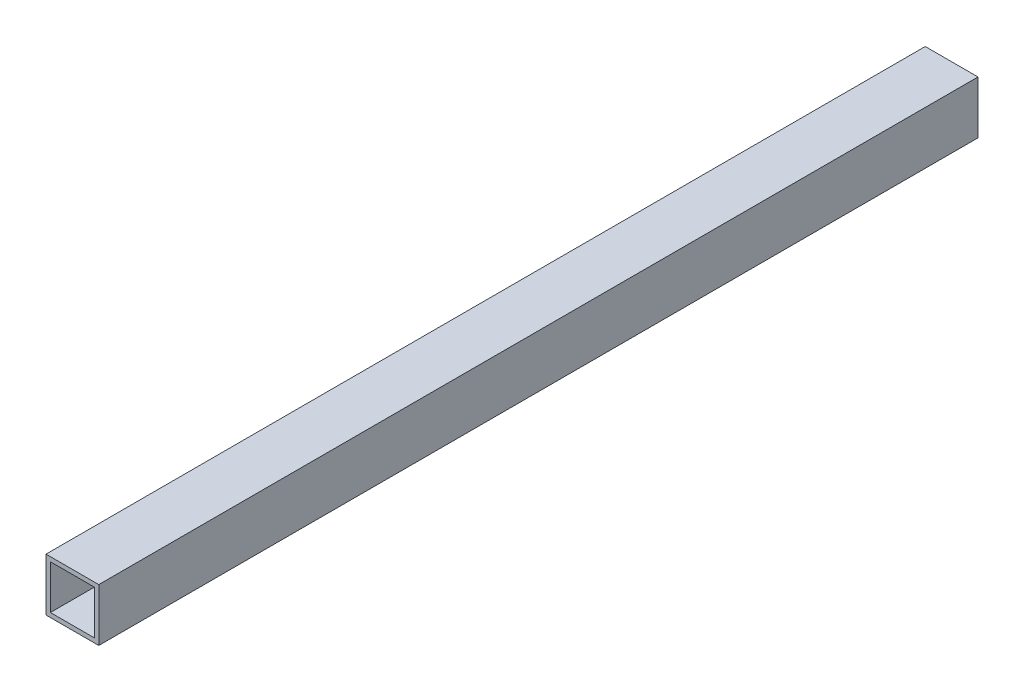
ISO-10303-21;
HEADER;
FILE_DESCRIPTION(('STEP AP214'),'2;1');
FILE_NAME('part.step','',(''),(''),'','','');
FILE_SCHEMA(('AUTOMOTIVE_DESIGN { 1 0 10303 214 1 1 1 1 }'));
ENDSEC;
DATA;
#1=APPLICATION_CONTEXT('core data for automotive mechanical design processes');
#2=APPLICATION_PROTOCOL_DEFINITION('international standard','automotive_design',2000,#1);
#3=PRODUCT_CONTEXT('',#1,'mechanical');
#4=PRODUCT('Part','Part','',(#3));
#5=PRODUCT_RELATED_PRODUCT_CATEGORY('part','',(#4));
#6=PRODUCT_DEFINITION_FORMATION('','',#4);
#7=PRODUCT_DEFINITION_CONTEXT('part definition',#1,'design');
#8=PRODUCT_DEFINITION('design','',#6,#7);
#9=PRODUCT_DEFINITION_SHAPE('','',#8);
#10=(LENGTH_UNIT() NAMED_UNIT(*) SI_UNIT(.MILLI.,.METRE.));
#11=(NAMED_UNIT(*) PLANE_ANGLE_UNIT() SI_UNIT($,.RADIAN.));
#12=(NAMED_UNIT(*) SI_UNIT($,.STERADIAN.) SOLID_ANGLE_UNIT());
#13=UNCERTAINTY_MEASURE_WITH_UNIT(LENGTH_MEASURE(1.E-05),#10,'distance_accuracy_value','');
#14=(GEOMETRIC_REPRESENTATION_CONTEXT(3) GLOBAL_UNCERTAINTY_ASSIGNED_CONTEXT((#13)) GLOBAL_UNIT_ASSIGNED_CONTEXT((#10,
#11,#12)) REPRESENTATION_CONTEXT('',''));
#15=CARTESIAN_POINT('',(0.,0.,0.));
#16=DIRECTION('',(0.,0.,1.));
#17=DIRECTION('',(1.,0.,0.));
#18=AXIS2_PLACEMENT_3D('',#15,#16,#17);
#19=CARTESIAN_POINT('',(0.,0.,250.));
#20=DIRECTION('',(0.,0.,1.));
#21=DIRECTION('',(1.,0.,0.));
#22=AXIS2_PLACEMENT_3D('',#19,#20,#21);
#23=PLANE('',#22);
#24=DIRECTION('',(1.,0.,0.));
#25=VECTOR('',#24,1.);
#26=CARTESIAN_POINT('',(-12.5,12.5,250.));
#27=LINE('',#26,#25);
#28=CARTESIAN_POINT('',(-12.5,12.5,250.));
#29=VERTEX_POINT('',#28);
#30=CARTESIAN_POINT('',(12.5,12.5,250.));
#31=VERTEX_POINT('',#30);
#32=EDGE_CURVE('E135',#29,#31,#27,.T.);
#33=ORIENTED_EDGE('',*,*,#32,.T.);
#34=DIRECTION('',(0.,-1.,0.));
#35=VECTOR('',#34,1.);
#36=CARTESIAN_POINT('',(12.5,12.5,250.));
#37=LINE('',#36,#35);
#38=CARTESIAN_POINT('',(12.5,-12.5,250.));
#39=VERTEX_POINT('',#38);
#40=EDGE_CURVE('E136',#31,#39,#37,.T.);
#41=ORIENTED_EDGE('',*,*,#40,.T.);
#42=DIRECTION('',(-1.,0.,0.));
#43=VECTOR('',#42,1.);
#44=CARTESIAN_POINT('',(12.5,-12.5,250.));
#45=LINE('',#44,#43);
#46=CARTESIAN_POINT('',(-12.5,-12.5,250.));
#47=VERTEX_POINT('',#46);
#48=EDGE_CURVE('E103',#39,#47,#45,.T.);
#49=ORIENTED_EDGE('',*,*,#48,.T.);
#50=DIRECTION('',(0.,1.,0.));
#51=VECTOR('',#50,1.);
#52=CARTESIAN_POINT('',(-12.5,-12.5,250.));
#53=LINE('',#52,#51);
#54=EDGE_CURVE('E102',#47,#29,#53,.T.);
#55=ORIENTED_EDGE('',*,*,#54,.T.);
#56=EDGE_LOOP('',(#33,#41,#49,#55));
#57=FACE_BOUND('',#56,.T.);
#58=DIRECTION('',(0.,-1.,0.));
#59=VECTOR('',#58,1.);
#60=CARTESIAN_POINT('',(-15.,15.,250.));
#61=LINE('',#60,#59);
#62=CARTESIAN_POINT('',(-15.,15.,250.));
#63=VERTEX_POINT('',#62);
#64=CARTESIAN_POINT('',(-15.,-15.,250.));
#65=VERTEX_POINT('',#64);
#66=EDGE_CURVE('E11',#63,#65,#61,.T.);
#67=ORIENTED_EDGE('',*,*,#66,.T.);
#68=DIRECTION('',(1.,0.,0.));
#69=VECTOR('',#68,1.);
#70=CARTESIAN_POINT('',(-15.,-15.,250.));
#71=LINE('',#70,#69);
#72=CARTESIAN_POINT('',(15.,-15.,250.));
#73=VERTEX_POINT('',#72);
#74=EDGE_CURVE('E155',#65,#73,#71,.T.);
#75=ORIENTED_EDGE('',*,*,#74,.T.);
#76=DIRECTION('',(0.,1.,0.));
#77=VECTOR('',#76,1.);
#78=CARTESIAN_POINT('',(15.,-15.,250.));
#79=LINE('',#78,#77);
#80=CARTESIAN_POINT('',(15.,15.,250.));
#81=VERTEX_POINT('',#80);
#82=EDGE_CURVE('E143',#73,#81,#79,.T.);
#83=ORIENTED_EDGE('',*,*,#82,.T.);
#84=DIRECTION('',(-1.,0.,0.));
#85=VECTOR('',#84,1.);
#86=CARTESIAN_POINT('',(15.,15.,250.));
#87=LINE('',#86,#85);
#88=EDGE_CURVE('E150',#81,#63,#87,.T.);
#89=ORIENTED_EDGE('',*,*,#88,.T.);
#90=EDGE_LOOP('',(#67,#75,#83,#89));
#91=FACE_BOUND('',#90,.T.);
#92=ADVANCED_FACE('F16',(#57,#91),#23,.T.);
#93=CARTESIAN_POINT('',(-15.,15.,0.));
#94=DIRECTION('',(-1.,0.,0.));
#95=DIRECTION('',(0.,-1.,0.));
#96=AXIS2_PLACEMENT_3D('',#93,#94,#95);
#97=PLANE('',#96);
#98=DIRECTION('',(0.,0.,1.));
#99=VECTOR('',#98,1.);
#100=CARTESIAN_POINT('',(-15.,-15.,0.));
#101=LINE('',#100,#99);
#102=CARTESIAN_POINT('',(-15.,-15.,-250.));
#103=VERTEX_POINT('',#102);
#104=EDGE_CURVE('E27',#103,#65,#101,.T.);
#105=ORIENTED_EDGE('',*,*,#104,.T.);
#106=ORIENTED_EDGE('',*,*,#66,.F.);
#107=DIRECTION('',(0.,0.,-1.));
#108=VECTOR('',#107,1.);
#109=CARTESIAN_POINT('',(-15.,15.,0.));
#110=LINE('',#109,#108);
#111=CARTESIAN_POINT('',(-15.,15.,-250.));
#112=VERTEX_POINT('',#111);
#113=EDGE_CURVE('E148',#63,#112,#110,.T.);
#114=ORIENTED_EDGE('',*,*,#113,.T.);
#115=DIRECTION('',(0.,1.,0.));
#116=VECTOR('',#115,1.);
#117=CARTESIAN_POINT('',(-15.,15.,-250.));
#118=LINE('',#117,#116);
#119=EDGE_CURVE('E130',#103,#112,#118,.T.);
#120=ORIENTED_EDGE('',*,*,#119,.F.);
#121=EDGE_LOOP('',(#105,#106,#114,#120));
#122=FACE_BOUND('',#121,.T.);
#123=ADVANCED_FACE('F174',(#122),#97,.T.);
#124=CARTESIAN_POINT('',(-15.,-15.,0.));
#125=DIRECTION('',(0.,-1.,0.));
#126=DIRECTION('',(1.,0.,0.));
#127=AXIS2_PLACEMENT_3D('',#124,#125,#126);
#128=PLANE('',#127);
#129=DIRECTION('',(0.,0.,1.));
#130=VECTOR('',#129,1.);
#131=CARTESIAN_POINT('',(15.,-15.,0.));
#132=LINE('',#131,#130);
#133=CARTESIAN_POINT('',(15.,-15.,-250.));
#134=VERTEX_POINT('',#133);
#135=EDGE_CURVE('E72',#134,#73,#132,.T.);
#136=ORIENTED_EDGE('',*,*,#135,.T.);
#137=ORIENTED_EDGE('',*,*,#74,.F.);
#138=ORIENTED_EDGE('',*,*,#104,.F.);
#139=DIRECTION('',(-1.,0.,0.));
#140=VECTOR('',#139,1.);
#141=CARTESIAN_POINT('',(-15.,-15.,-250.));
#142=LINE('',#141,#140);
#143=EDGE_CURVE('E122',#134,#103,#142,.T.);
#144=ORIENTED_EDGE('',*,*,#143,.F.);
#145=EDGE_LOOP('',(#136,#137,#138,#144));
#146=FACE_BOUND('',#145,.T.);
#147=ADVANCED_FACE('F177',(#146),#128,.T.);
#148=CARTESIAN_POINT('',(15.,-15.,0.));
#149=DIRECTION('',(1.,0.,0.));
#150=DIRECTION('',(0.,1.,0.));
#151=AXIS2_PLACEMENT_3D('',#148,#149,#150);
#152=PLANE('',#151);
#153=DIRECTION('',(0.,0.,1.));
#154=VECTOR('',#153,1.);
#155=CARTESIAN_POINT('',(15.,15.,0.));
#156=LINE('',#155,#154);
#157=CARTESIAN_POINT('',(15.,15.,-250.));
#158=VERTEX_POINT('',#157);
#159=EDGE_CURVE('E20',#158,#81,#156,.T.);
#160=ORIENTED_EDGE('',*,*,#159,.T.);
#161=ORIENTED_EDGE('',*,*,#82,.F.);
#162=ORIENTED_EDGE('',*,*,#135,.F.);
#163=DIRECTION('',(0.,-1.,0.));
#164=VECTOR('',#163,1.);
#165=CARTESIAN_POINT('',(15.,-15.,-250.));
#166=LINE('',#165,#164);
#167=EDGE_CURVE('E129',#158,#134,#166,.T.);
#168=ORIENTED_EDGE('',*,*,#167,.F.);
#169=EDGE_LOOP('',(#160,#161,#162,#168));
#170=FACE_BOUND('',#169,.T.);
#171=ADVANCED_FACE('F167',(#170),#152,.T.);
#172=CARTESIAN_POINT('',(15.,15.,0.));
#173=DIRECTION('',(0.,1.,0.));
#174=DIRECTION('',(-1.,0.,0.));
#175=AXIS2_PLACEMENT_3D('',#172,#173,#174);
#176=PLANE('',#175);
#177=ORIENTED_EDGE('',*,*,#113,.F.);
#178=ORIENTED_EDGE('',*,*,#88,.F.);
#179=ORIENTED_EDGE('',*,*,#159,.F.);
#180=DIRECTION('',(1.,0.,0.));
#181=VECTOR('',#180,1.);
#182=CARTESIAN_POINT('',(15.,15.,-250.));
#183=LINE('',#182,#181);
#184=EDGE_CURVE('E126',#112,#158,#183,.T.);
#185=ORIENTED_EDGE('',*,*,#184,.F.);
#186=EDGE_LOOP('',(#177,#178,#179,#185));
#187=FACE_BOUND('',#186,.T.);
#188=ADVANCED_FACE('F170',(#187),#176,.T.);
#189=CARTESIAN_POINT('',(-12.5,12.5,0.));
#190=DIRECTION('',(0.,-1.,0.));
#191=DIRECTION('',(1.,0.,0.));
#192=AXIS2_PLACEMENT_3D('',#189,#190,#191);
#193=PLANE('',#192);
#194=DIRECTION('',(0.,0.,1.));
#195=VECTOR('',#194,1.);
#196=CARTESIAN_POINT('',(12.5,12.5,0.));
#197=LINE('',#196,#195);
#198=CARTESIAN_POINT('',(12.5,12.5,-250.));
#199=VERTEX_POINT('',#198);
#200=EDGE_CURVE('E63',#199,#31,#197,.T.);
#201=ORIENTED_EDGE('',*,*,#200,.T.);
#202=ORIENTED_EDGE('',*,*,#32,.F.);
#203=DIRECTION('',(0.,0.,-1.));
#204=VECTOR('',#203,1.);
#205=CARTESIAN_POINT('',(-12.5,12.5,0.));
#206=LINE('',#205,#204);
#207=CARTESIAN_POINT('',(-12.5,12.5,-250.));
#208=VERTEX_POINT('',#207);
#209=EDGE_CURVE('E133',#29,#208,#206,.T.);
#210=ORIENTED_EDGE('',*,*,#209,.T.);
#211=DIRECTION('',(-1.,0.,0.));
#212=VECTOR('',#211,1.);
#213=CARTESIAN_POINT('',(-12.5,12.5,-250.));
#214=LINE('',#213,#212);
#215=EDGE_CURVE('E115',#199,#208,#214,.T.);
#216=ORIENTED_EDGE('',*,*,#215,.F.);
#217=EDGE_LOOP('',(#201,#202,#210,#216));
#218=FACE_BOUND('',#217,.T.);
#219=ADVANCED_FACE('F18',(#218),#193,.T.);
#220=CARTESIAN_POINT('',(12.5,12.5,0.));
#221=DIRECTION('',(-1.,0.,0.));
#222=DIRECTION('',(0.,-1.,0.));
#223=AXIS2_PLACEMENT_3D('',#220,#221,#222);
#224=PLANE('',#223);
#225=DIRECTION('',(0.,0.,1.));
#226=VECTOR('',#225,1.);
#227=CARTESIAN_POINT('',(12.5,-12.5,0.));
#228=LINE('',#227,#226);
#229=CARTESIAN_POINT('',(12.5,-12.5,-250.));
#230=VERTEX_POINT('',#229);
#231=EDGE_CURVE('E89',#230,#39,#228,.T.);
#232=ORIENTED_EDGE('',*,*,#231,.T.);
#233=ORIENTED_EDGE('',*,*,#40,.F.);
#234=ORIENTED_EDGE('',*,*,#200,.F.);
#235=DIRECTION('',(0.,1.,0.));
#236=VECTOR('',#235,1.);
#237=CARTESIAN_POINT('',(12.5,12.5,-250.));
#238=LINE('',#237,#236);
#239=EDGE_CURVE('E110',#230,#199,#238,.T.);
#240=ORIENTED_EDGE('',*,*,#239,.F.);
#241=EDGE_LOOP('',(#232,#233,#234,#240));
#242=FACE_BOUND('',#241,.T.);
#243=ADVANCED_FACE('F192',(#242),#224,.T.);
#244=CARTESIAN_POINT('',(12.5,-12.5,0.));
#245=DIRECTION('',(0.,1.,0.));
#246=DIRECTION('',(-1.,0.,0.));
#247=AXIS2_PLACEMENT_3D('',#244,#245,#246);
#248=PLANE('',#247);
#249=DIRECTION('',(0.,0.,1.));
#250=VECTOR('',#249,1.);
#251=CARTESIAN_POINT('',(-12.5,-12.5,0.));
#252=LINE('',#251,#250);
#253=CARTESIAN_POINT('',(-12.5,-12.5,-250.));
#254=VERTEX_POINT('',#253);
#255=EDGE_CURVE('E95',#254,#47,#252,.T.);
#256=ORIENTED_EDGE('',*,*,#255,.T.);
#257=ORIENTED_EDGE('',*,*,#48,.F.);
#258=ORIENTED_EDGE('',*,*,#231,.F.);
#259=DIRECTION('',(1.,0.,0.));
#260=VECTOR('',#259,1.);
#261=CARTESIAN_POINT('',(12.5,-12.5,-250.));
#262=LINE('',#261,#260);
#263=EDGE_CURVE('E106',#254,#230,#262,.T.);
#264=ORIENTED_EDGE('',*,*,#263,.F.);
#265=EDGE_LOOP('',(#256,#257,#258,#264));
#266=FACE_BOUND('',#265,.T.);
#267=ADVANCED_FACE('F107',(#266),#248,.T.);
#268=CARTESIAN_POINT('',(-12.5,-12.5,0.));
#269=DIRECTION('',(1.,0.,0.));
#270=DIRECTION('',(0.,1.,0.));
#271=AXIS2_PLACEMENT_3D('',#268,#269,#270);
#272=PLANE('',#271);
#273=ORIENTED_EDGE('',*,*,#209,.F.);
#274=ORIENTED_EDGE('',*,*,#54,.F.);
#275=ORIENTED_EDGE('',*,*,#255,.F.);
#276=DIRECTION('',(0.,-1.,0.));
#277=VECTOR('',#276,1.);
#278=CARTESIAN_POINT('',(-12.5,-12.5,-250.));
#279=LINE('',#278,#277);
#280=EDGE_CURVE('E99',#208,#254,#279,.T.);
#281=ORIENTED_EDGE('',*,*,#280,.F.);
#282=EDGE_LOOP('',(#273,#274,#275,#281));
#283=FACE_BOUND('',#282,.T.);
#284=ADVANCED_FACE('F97',(#283),#272,.T.);
#285=CARTESIAN_POINT('',(0.,0.,-250.));
#286=DIRECTION('',(0.,0.,-1.));
#287=DIRECTION('',(-1.,0.,0.));
#288=AXIS2_PLACEMENT_3D('',#285,#286,#287);
#289=PLANE('',#288);
#290=ORIENTED_EDGE('',*,*,#215,.T.);
#291=ORIENTED_EDGE('',*,*,#280,.T.);
#292=ORIENTED_EDGE('',*,*,#263,.T.);
#293=ORIENTED_EDGE('',*,*,#239,.T.);
#294=EDGE_LOOP('',(#290,#291,#292,#293));
#295=FACE_BOUND('',#294,.T.);
#296=ORIENTED_EDGE('',*,*,#119,.T.);
#297=ORIENTED_EDGE('',*,*,#184,.T.);
#298=ORIENTED_EDGE('',*,*,#167,.T.);
#299=ORIENTED_EDGE('',*,*,#143,.T.);
#300=EDGE_LOOP('',(#296,#297,#298,#299));
#301=FACE_BOUND('',#300,.T.);
#302=ADVANCED_FACE('F112',(#295,#301),#289,.T.);
#303=CLOSED_SHELL('',(#92,#123,#147,#171,#188,#219,#243,#267,#284,#302));
#304=MANIFOLD_SOLID_BREP('B1',#303);
#305=ADVANCED_BREP_SHAPE_REPRESENTATION('',(#18,#304),#14);
#306=SHAPE_DEFINITION_REPRESENTATION(#9,#305);
ENDSEC;
END-ISO-10303-21;
